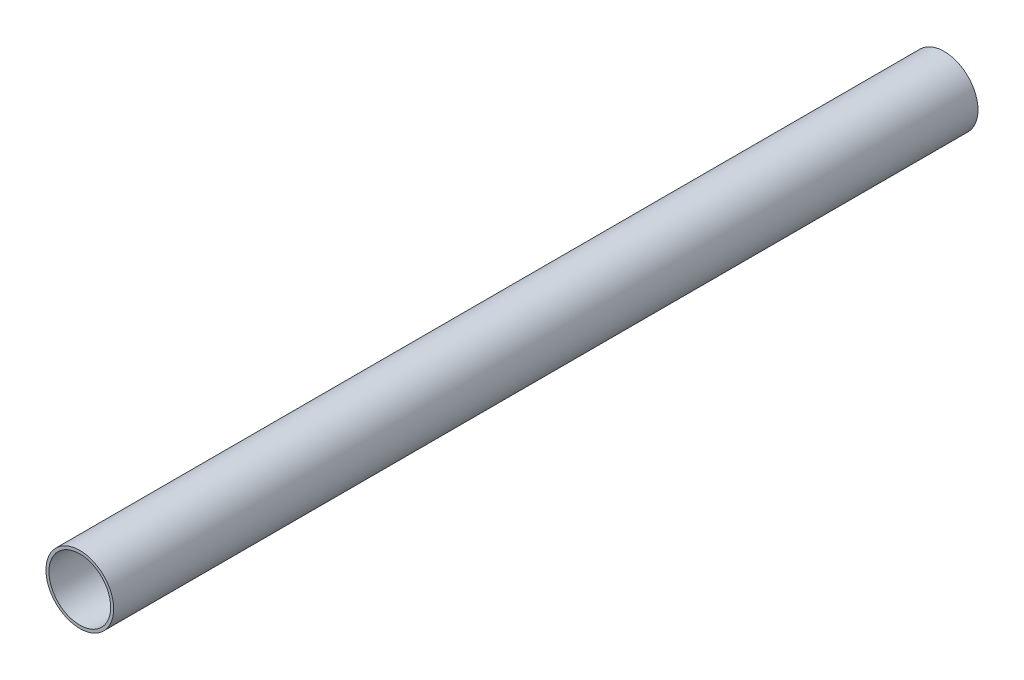
ISO-10303-21;
HEADER;
FILE_DESCRIPTION(('STEP AP214'),'2;1');
FILE_NAME('part.step','',(''),(''),'','','');
FILE_SCHEMA(('AUTOMOTIVE_DESIGN { 1 0 10303 214 1 1 1 1 }'));
ENDSEC;
DATA;
#1=APPLICATION_CONTEXT('core data for automotive mechanical design processes');
#2=APPLICATION_PROTOCOL_DEFINITION('international standard','automotive_design',2000,#1);
#3=PRODUCT_CONTEXT('',#1,'mechanical');
#4=PRODUCT('Part','Part','',(#3));
#5=PRODUCT_RELATED_PRODUCT_CATEGORY('part','',(#4));
#6=PRODUCT_DEFINITION_FORMATION('','',#4);
#7=PRODUCT_DEFINITION_CONTEXT('part definition',#1,'design');
#8=PRODUCT_DEFINITION('design','',#6,#7);
#9=PRODUCT_DEFINITION_SHAPE('','',#8);
#10=(LENGTH_UNIT() NAMED_UNIT(*) SI_UNIT(.MILLI.,.METRE.));
#11=(NAMED_UNIT(*) PLANE_ANGLE_UNIT() SI_UNIT($,.RADIAN.));
#12=(NAMED_UNIT(*) SI_UNIT($,.STERADIAN.) SOLID_ANGLE_UNIT());
#13=UNCERTAINTY_MEASURE_WITH_UNIT(LENGTH_MEASURE(1.E-05),#10,'distance_accuracy_value','');
#14=(GEOMETRIC_REPRESENTATION_CONTEXT(3) GLOBAL_UNCERTAINTY_ASSIGNED_CONTEXT((#13)) GLOBAL_UNIT_ASSIGNED_CONTEXT((#10,
#11,#12)) REPRESENTATION_CONTEXT('',''));
#15=CARTESIAN_POINT('',(0.,0.,0.));
#16=DIRECTION('',(0.,0.,1.));
#17=DIRECTION('',(1.,0.,0.));
#18=AXIS2_PLACEMENT_3D('',#15,#16,#17);
#19=CARTESIAN_POINT('',(0.,0.,177.8));
#20=DIRECTION('',(0.,0.,1.));
#21=DIRECTION('',(1.,0.,0.));
#22=AXIS2_PLACEMENT_3D('',#19,#20,#21);
#23=PLANE('',#22);
#24=CARTESIAN_POINT('',(0.,0.,177.8));
#25=DIRECTION('',(0.,0.,1.));
#26=DIRECTION('',(1.,0.,0.));
#27=AXIS2_PLACEMENT_3D('',#24,#25,#26);
#28=CIRCLE('',#27,13.930255964985);
#29=CARTESIAN_POINT('',(13.930255964985,0.,177.8));
#30=VERTEX_POINT('',#29);
#31=EDGE_CURVE('E10',#30,#30,#28,.T.);
#32=ORIENTED_EDGE('',*,*,#31,.T.);
#33=EDGE_LOOP('',(#32));
#34=FACE_BOUND('',#33,.T.);
#35=CARTESIAN_POINT('',(0.,0.,177.8));
#36=DIRECTION('',(0.,0.,1.));
#37=DIRECTION('',(1.,0.,0.));
#38=AXIS2_PLACEMENT_3D('',#35,#36,#37);
#39=CIRCLE('',#38,12.7);
#40=CARTESIAN_POINT('',(12.7,0.,177.8));
#41=VERTEX_POINT('',#40);
#42=EDGE_CURVE('E54',#41,#41,#39,.T.);
#43=ORIENTED_EDGE('',*,*,#42,.F.);
#44=EDGE_LOOP('',(#43));
#45=FACE_BOUND('',#44,.T.);
#46=ADVANCED_FACE('F41',(#34,#45),#23,.T.);
#47=CARTESIAN_POINT('',(0.,0.,-177.8));
#48=DIRECTION('',(0.,0.,1.));
#49=DIRECTION('',(1.,0.,0.));
#50=AXIS2_PLACEMENT_3D('',#47,#48,#49);
#51=PLANE('',#50);
#52=CARTESIAN_POINT('',(0.,0.,-177.8));
#53=DIRECTION('',(0.,0.,1.));
#54=DIRECTION('',(1.,0.,0.));
#55=AXIS2_PLACEMENT_3D('',#52,#53,#54);
#56=CIRCLE('',#55,13.930255964985);
#57=CARTESIAN_POINT('',(13.930255964985,0.,-177.8));
#58=VERTEX_POINT('',#57);
#59=EDGE_CURVE('E45',#58,#58,#56,.T.);
#60=ORIENTED_EDGE('',*,*,#59,.F.);
#61=EDGE_LOOP('',(#60));
#62=FACE_BOUND('',#61,.T.);
#63=CARTESIAN_POINT('',(0.,0.,-177.8));
#64=DIRECTION('',(0.,0.,1.));
#65=DIRECTION('',(1.,0.,0.));
#66=AXIS2_PLACEMENT_3D('',#63,#64,#65);
#67=CIRCLE('',#66,12.7);
#68=CARTESIAN_POINT('',(12.7,0.,-177.8));
#69=VERTEX_POINT('',#68);
#70=EDGE_CURVE('E56',#69,#69,#67,.T.);
#71=ORIENTED_EDGE('',*,*,#70,.T.);
#72=EDGE_LOOP('',(#71));
#73=FACE_BOUND('',#72,.T.);
#74=ADVANCED_FACE('F68',(#62,#73),#51,.F.);
#75=CARTESIAN_POINT('',(0.,0.,177.8));
#76=DIRECTION('',(0.,0.,-1.));
#77=DIRECTION('',(-1.,0.,0.));
#78=AXIS2_PLACEMENT_3D('',#75,#76,#77);
#79=CYLINDRICAL_SURFACE('',#78,13.930255964985);
#80=ORIENTED_EDGE('',*,*,#31,.F.);
#81=EDGE_LOOP('',(#80));
#82=FACE_BOUND('',#81,.T.);
#83=ORIENTED_EDGE('',*,*,#59,.T.);
#84=EDGE_LOOP('',(#83));
#85=FACE_BOUND('',#84,.T.);
#86=ADVANCED_FACE('F43',(#82,#85),#79,.T.);
#87=CARTESIAN_POINT('',(0.,0.,177.8));
#88=DIRECTION('',(0.,0.,-1.));
#89=DIRECTION('',(-1.,0.,0.));
#90=AXIS2_PLACEMENT_3D('',#87,#88,#89);
#91=CYLINDRICAL_SURFACE('',#90,12.7);
#92=ORIENTED_EDGE('',*,*,#42,.T.);
#93=EDGE_LOOP('',(#92));
#94=FACE_BOUND('',#93,.T.);
#95=ORIENTED_EDGE('',*,*,#70,.F.);
#96=EDGE_LOOP('',(#95));
#97=FACE_BOUND('',#96,.T.);
#98=ADVANCED_FACE('F64',(#94,#97),#91,.F.);
#99=CLOSED_SHELL('',(#46,#74,#86,#98));
#100=MANIFOLD_SOLID_BREP('B2',#99);
#101=ADVANCED_BREP_SHAPE_REPRESENTATION('',(#18,#100),#14);
#102=SHAPE_DEFINITION_REPRESENTATION(#9,#101);
ENDSEC;
END-ISO-10303-21;
